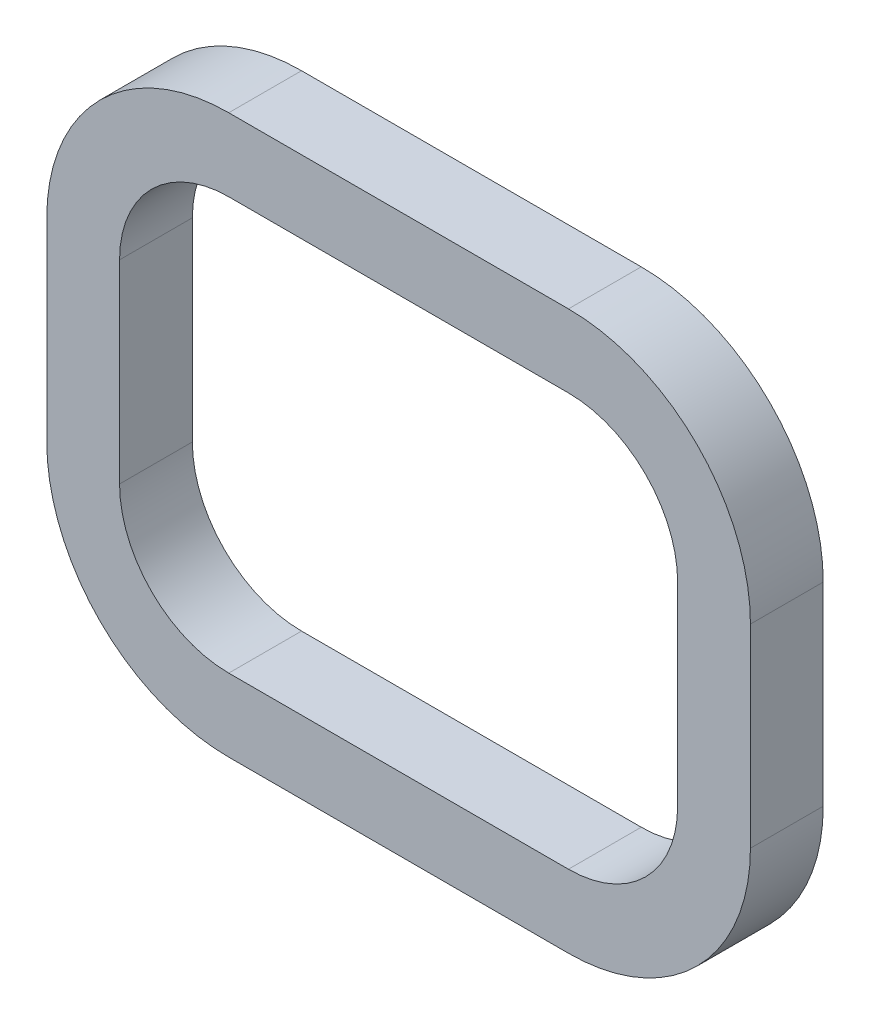
ISO-10303-21;
HEADER;
FILE_DESCRIPTION(('STEP AP214'),'2;1');
FILE_NAME('part.step','',(''),(''),'','','');
FILE_SCHEMA(('AUTOMOTIVE_DESIGN { 1 0 10303 214 1 1 1 1 }'));
ENDSEC;
DATA;
#1=APPLICATION_CONTEXT('core data for automotive mechanical design processes');
#2=APPLICATION_PROTOCOL_DEFINITION('international standard','automotive_design',2000,#1);
#3=PRODUCT_CONTEXT('',#1,'mechanical');
#4=PRODUCT('Part','Part','',(#3));
#5=PRODUCT_RELATED_PRODUCT_CATEGORY('part','',(#4));
#6=PRODUCT_DEFINITION_FORMATION('','',#4);
#7=PRODUCT_DEFINITION_CONTEXT('part definition',#1,'design');
#8=PRODUCT_DEFINITION('design','',#6,#7);
#9=PRODUCT_DEFINITION_SHAPE('','',#8);
#10=(LENGTH_UNIT() NAMED_UNIT(*) SI_UNIT(.MILLI.,.METRE.));
#11=(NAMED_UNIT(*) PLANE_ANGLE_UNIT() SI_UNIT($,.RADIAN.));
#12=(NAMED_UNIT(*) SI_UNIT($,.STERADIAN.) SOLID_ANGLE_UNIT());
#13=UNCERTAINTY_MEASURE_WITH_UNIT(LENGTH_MEASURE(1.E-05),#10,'distance_accuracy_value','');
#14=(GEOMETRIC_REPRESENTATION_CONTEXT(3) GLOBAL_UNCERTAINTY_ASSIGNED_CONTEXT((#13)) GLOBAL_UNIT_ASSIGNED_CONTEXT((#10,
#11,#12)) REPRESENTATION_CONTEXT('',''));
#15=CARTESIAN_POINT('',(0.,0.,0.));
#16=DIRECTION('',(0.,0.,1.));
#17=DIRECTION('',(1.,0.,0.));
#18=AXIS2_PLACEMENT_3D('',#15,#16,#17);
#19=CARTESIAN_POINT('',(35.,20.,7.5));
#20=DIRECTION('',(0.,0.,-1.));
#21=DIRECTION('',(-1.,0.,0.));
#22=AXIS2_PLACEMENT_3D('',#19,#20,#21);
#23=PLANE('',#22);
#24=CARTESIAN_POINT('',(35.,20.,7.5));
#25=DIRECTION('',(0.,0.,-1.));
#26=DIRECTION('',(-1.,0.,0.));
#27=AXIS2_PLACEMENT_3D('',#24,#25,#26);
#28=CIRCLE('',#27,37.5);
#29=CARTESIAN_POINT('',(72.5,20.,7.5));
#30=VERTEX_POINT('',#29);
#31=CARTESIAN_POINT('',(35.,57.5,7.5));
#32=VERTEX_POINT('',#31);
#33=EDGE_CURVE('E262',#30,#32,#28,.F.);
#34=ORIENTED_EDGE('',*,*,#33,.T.);
#35=DIRECTION('',(-1.,0.,0.));
#36=VECTOR('',#35,1.);
#37=CARTESIAN_POINT('',(35.,57.5,7.5));
#38=LINE('',#37,#36);
#39=CARTESIAN_POINT('',(-35.,57.5,7.5));
#40=VERTEX_POINT('',#39);
#41=EDGE_CURVE('E265',#32,#40,#38,.T.);
#42=ORIENTED_EDGE('',*,*,#41,.T.);
#43=CARTESIAN_POINT('',(-35.,20.,7.5));
#44=DIRECTION('',(0.,0.,-1.));
#45=DIRECTION('',(-1.,0.,0.));
#46=AXIS2_PLACEMENT_3D('',#43,#44,#45);
#47=CIRCLE('',#46,37.5);
#48=CARTESIAN_POINT('',(-72.5,20.,7.5));
#49=VERTEX_POINT('',#48);
#50=EDGE_CURVE('E268',#40,#49,#47,.F.);
#51=ORIENTED_EDGE('',*,*,#50,.T.);
#52=DIRECTION('',(0.,-1.,0.));
#53=VECTOR('',#52,1.);
#54=CARTESIAN_POINT('',(-72.5,20.,7.5));
#55=LINE('',#54,#53);
#56=CARTESIAN_POINT('',(-72.5,-20.,7.5));
#57=VERTEX_POINT('',#56);
#58=EDGE_CURVE('E270',#49,#57,#55,.T.);
#59=ORIENTED_EDGE('',*,*,#58,.T.);
#60=CARTESIAN_POINT('',(-35.,-20.,7.5));
#61=DIRECTION('',(0.,0.,-1.));
#62=DIRECTION('',(-1.,0.,0.));
#63=AXIS2_PLACEMENT_3D('',#60,#61,#62);
#64=CIRCLE('',#63,37.5);
#65=CARTESIAN_POINT('',(-35.,-57.5,7.5));
#66=VERTEX_POINT('',#65);
#67=EDGE_CURVE('E272',#57,#66,#64,.F.);
#68=ORIENTED_EDGE('',*,*,#67,.T.);
#69=DIRECTION('',(1.,0.,0.));
#70=VECTOR('',#69,1.);
#71=CARTESIAN_POINT('',(35.,-57.5,7.5));
#72=LINE('',#71,#70);
#73=CARTESIAN_POINT('',(35.,-57.5,7.5));
#74=VERTEX_POINT('',#73);
#75=EDGE_CURVE('E274',#66,#74,#72,.T.);
#76=ORIENTED_EDGE('',*,*,#75,.T.);
#77=CARTESIAN_POINT('',(35.,-20.,7.5));
#78=DIRECTION('',(0.,0.,-1.));
#79=DIRECTION('',(-1.,0.,0.));
#80=AXIS2_PLACEMENT_3D('',#77,#78,#79);
#81=CIRCLE('',#80,37.5);
#82=CARTESIAN_POINT('',(72.5,-20.,7.5));
#83=VERTEX_POINT('',#82);
#84=EDGE_CURVE('E276',#74,#83,#81,.F.);
#85=ORIENTED_EDGE('',*,*,#84,.T.);
#86=DIRECTION('',(0.,1.,0.));
#87=VECTOR('',#86,1.);
#88=CARTESIAN_POINT('',(72.5,20.,7.5));
#89=LINE('',#88,#87);
#90=EDGE_CURVE('E278',#83,#30,#89,.T.);
#91=ORIENTED_EDGE('',*,*,#90,.T.);
#92=EDGE_LOOP('',(#34,#42,#51,#59,#68,#76,#85,#91));
#93=FACE_BOUND('',#92,.T.);
#94=CARTESIAN_POINT('',(35.,20.,7.5));
#95=DIRECTION('',(0.,0.,-1.));
#96=DIRECTION('',(-1.,0.,0.));
#97=AXIS2_PLACEMENT_3D('',#94,#95,#96);
#98=CIRCLE('',#97,22.5);
#99=CARTESIAN_POINT('',(57.5,20.,7.5));
#100=VERTEX_POINT('',#99);
#101=CARTESIAN_POINT('',(35.,42.5,7.5));
#102=VERTEX_POINT('',#101);
#103=EDGE_CURVE('E197',#100,#102,#98,.F.);
#104=ORIENTED_EDGE('',*,*,#103,.F.);
#105=DIRECTION('',(0.,1.,0.));
#106=VECTOR('',#105,1.);
#107=CARTESIAN_POINT('',(57.5,20.,7.5));
#108=LINE('',#107,#106);
#109=CARTESIAN_POINT('',(57.5,-20.,7.5));
#110=VERTEX_POINT('',#109);
#111=EDGE_CURVE('E230',#110,#100,#108,.T.);
#112=ORIENTED_EDGE('',*,*,#111,.F.);
#113=CARTESIAN_POINT('',(35.,-20.,7.5));
#114=DIRECTION('',(0.,0.,-1.));
#115=DIRECTION('',(-1.,0.,0.));
#116=AXIS2_PLACEMENT_3D('',#113,#114,#115);
#117=CIRCLE('',#116,22.5);
#118=CARTESIAN_POINT('',(35.,-42.5,7.5));
#119=VERTEX_POINT('',#118);
#120=EDGE_CURVE('E228',#119,#110,#117,.F.);
#121=ORIENTED_EDGE('',*,*,#120,.F.);
#122=DIRECTION('',(1.,0.,0.));
#123=VECTOR('',#122,1.);
#124=CARTESIAN_POINT('',(35.,-42.5,7.5));
#125=LINE('',#124,#123);
#126=CARTESIAN_POINT('',(-35.,-42.5,7.5));
#127=VERTEX_POINT('',#126);
#128=EDGE_CURVE('E226',#127,#119,#125,.T.);
#129=ORIENTED_EDGE('',*,*,#128,.F.);
#130=CARTESIAN_POINT('',(-35.,-20.,7.5));
#131=DIRECTION('',(0.,0.,-1.));
#132=DIRECTION('',(-1.,0.,0.));
#133=AXIS2_PLACEMENT_3D('',#130,#131,#132);
#134=CIRCLE('',#133,22.5);
#135=CARTESIAN_POINT('',(-57.5,-20.,7.5));
#136=VERTEX_POINT('',#135);
#137=EDGE_CURVE('E224',#136,#127,#134,.F.);
#138=ORIENTED_EDGE('',*,*,#137,.F.);
#139=DIRECTION('',(0.,-1.,0.));
#140=VECTOR('',#139,1.);
#141=CARTESIAN_POINT('',(-57.5,20.,7.5));
#142=LINE('',#141,#140);
#143=CARTESIAN_POINT('',(-57.5,20.,7.5));
#144=VERTEX_POINT('',#143);
#145=EDGE_CURVE('E220',#144,#136,#142,.T.);
#146=ORIENTED_EDGE('',*,*,#145,.F.);
#147=CARTESIAN_POINT('',(-35.,20.,7.5));
#148=DIRECTION('',(0.,0.,-1.));
#149=DIRECTION('',(-1.,0.,0.));
#150=AXIS2_PLACEMENT_3D('',#147,#148,#149);
#151=CIRCLE('',#150,22.5);
#152=CARTESIAN_POINT('',(-35.,42.5,7.5));
#153=VERTEX_POINT('',#152);
#154=EDGE_CURVE('E218',#153,#144,#151,.F.);
#155=ORIENTED_EDGE('',*,*,#154,.F.);
#156=DIRECTION('',(-1.,0.,0.));
#157=VECTOR('',#156,1.);
#158=CARTESIAN_POINT('',(35.,42.5,7.5));
#159=LINE('',#158,#157);
#160=EDGE_CURVE('E205',#102,#153,#159,.T.);
#161=ORIENTED_EDGE('',*,*,#160,.F.);
#162=EDGE_LOOP('',(#104,#112,#121,#129,#138,#146,#155,#161));
#163=FACE_BOUND('',#162,.T.);
#164=ADVANCED_FACE('F84',(#93,#163),#23,.F.);
#165=CARTESIAN_POINT('',(35.,20.,-7.5));
#166=DIRECTION('',(0.,0.,-1.));
#167=DIRECTION('',(-1.,0.,0.));
#168=AXIS2_PLACEMENT_3D('',#165,#166,#167);
#169=PLANE('',#168);
#170=CARTESIAN_POINT('',(35.,20.,-7.5));
#171=DIRECTION('',(0.,0.,-1.));
#172=DIRECTION('',(-1.,0.,0.));
#173=AXIS2_PLACEMENT_3D('',#170,#171,#172);
#174=CIRCLE('',#173,37.5);
#175=CARTESIAN_POINT('',(72.5,20.,-7.5));
#176=VERTEX_POINT('',#175);
#177=CARTESIAN_POINT('',(35.,57.5,-7.5));
#178=VERTEX_POINT('',#177);
#179=EDGE_CURVE('E213',#176,#178,#174,.F.);
#180=ORIENTED_EDGE('',*,*,#179,.F.);
#181=DIRECTION('',(0.,1.,0.));
#182=VECTOR('',#181,1.);
#183=CARTESIAN_POINT('',(72.5,20.,-7.5));
#184=LINE('',#183,#182);
#185=CARTESIAN_POINT('',(72.5,-20.,-7.5));
#186=VERTEX_POINT('',#185);
#187=EDGE_CURVE('E266',#186,#176,#184,.T.);
#188=ORIENTED_EDGE('',*,*,#187,.F.);
#189=CARTESIAN_POINT('',(35.,-20.,-7.5));
#190=DIRECTION('',(0.,0.,-1.));
#191=DIRECTION('',(-1.,0.,0.));
#192=AXIS2_PLACEMENT_3D('',#189,#190,#191);
#193=CIRCLE('',#192,37.5);
#194=CARTESIAN_POINT('',(35.,-57.5,-7.5));
#195=VERTEX_POINT('',#194);
#196=EDGE_CURVE('E293',#195,#186,#193,.F.);
#197=ORIENTED_EDGE('',*,*,#196,.F.);
#198=DIRECTION('',(1.,0.,0.));
#199=VECTOR('',#198,1.);
#200=CARTESIAN_POINT('',(35.,-57.5,-7.5));
#201=LINE('',#200,#199);
#202=CARTESIAN_POINT('',(-35.,-57.5,-7.5));
#203=VERTEX_POINT('',#202);
#204=EDGE_CURVE('E291',#203,#195,#201,.T.);
#205=ORIENTED_EDGE('',*,*,#204,.F.);
#206=CARTESIAN_POINT('',(-35.,-20.,-7.5));
#207=DIRECTION('',(0.,0.,-1.));
#208=DIRECTION('',(-1.,0.,0.));
#209=AXIS2_PLACEMENT_3D('',#206,#207,#208);
#210=CIRCLE('',#209,37.5);
#211=CARTESIAN_POINT('',(-72.5,-20.,-7.5));
#212=VERTEX_POINT('',#211);
#213=EDGE_CURVE('E289',#212,#203,#210,.F.);
#214=ORIENTED_EDGE('',*,*,#213,.F.);
#215=DIRECTION('',(0.,-1.,0.));
#216=VECTOR('',#215,1.);
#217=CARTESIAN_POINT('',(-72.5,20.,-7.5));
#218=LINE('',#217,#216);
#219=CARTESIAN_POINT('',(-72.5,20.,-7.5));
#220=VERTEX_POINT('',#219);
#221=EDGE_CURVE('E287',#220,#212,#218,.T.);
#222=ORIENTED_EDGE('',*,*,#221,.F.);
#223=CARTESIAN_POINT('',(-35.,20.,-7.5));
#224=DIRECTION('',(0.,0.,-1.));
#225=DIRECTION('',(-1.,0.,0.));
#226=AXIS2_PLACEMENT_3D('',#223,#224,#225);
#227=CIRCLE('',#226,37.5);
#228=CARTESIAN_POINT('',(-35.,57.5,-7.5));
#229=VERTEX_POINT('',#228);
#230=EDGE_CURVE('E285',#229,#220,#227,.F.);
#231=ORIENTED_EDGE('',*,*,#230,.F.);
#232=DIRECTION('',(-1.,0.,0.));
#233=VECTOR('',#232,1.);
#234=CARTESIAN_POINT('',(35.,57.5,-7.5));
#235=LINE('',#234,#233);
#236=EDGE_CURVE('E283',#178,#229,#235,.T.);
#237=ORIENTED_EDGE('',*,*,#236,.F.);
#238=EDGE_LOOP('',(#180,#188,#197,#205,#214,#222,#231,#237));
#239=FACE_BOUND('',#238,.T.);
#240=DIRECTION('',(0.,1.,0.));
#241=VECTOR('',#240,1.);
#242=CARTESIAN_POINT('',(57.5,20.,-7.5));
#243=LINE('',#242,#241);
#244=CARTESIAN_POINT('',(57.5,-20.,-7.5));
#245=VERTEX_POINT('',#244);
#246=CARTESIAN_POINT('',(57.5,20.,-7.5));
#247=VERTEX_POINT('',#246);
#248=EDGE_CURVE('E206',#245,#247,#243,.T.);
#249=ORIENTED_EDGE('',*,*,#248,.T.);
#250=CARTESIAN_POINT('',(35.,20.,-7.5));
#251=DIRECTION('',(0.,0.,-1.));
#252=DIRECTION('',(-1.,0.,0.));
#253=AXIS2_PLACEMENT_3D('',#250,#251,#252);
#254=CIRCLE('',#253,22.5);
#255=CARTESIAN_POINT('',(35.,42.5,-7.5));
#256=VERTEX_POINT('',#255);
#257=EDGE_CURVE('E107',#247,#256,#254,.F.);
#258=ORIENTED_EDGE('',*,*,#257,.T.);
#259=DIRECTION('',(-1.,0.,0.));
#260=VECTOR('',#259,1.);
#261=CARTESIAN_POINT('',(35.,42.5,-7.5));
#262=LINE('',#261,#260);
#263=CARTESIAN_POINT('',(-35.,42.5,-7.5));
#264=VERTEX_POINT('',#263);
#265=EDGE_CURVE('E212',#256,#264,#262,.T.);
#266=ORIENTED_EDGE('',*,*,#265,.T.);
#267=CARTESIAN_POINT('',(-35.,20.,-7.5));
#268=DIRECTION('',(0.,0.,-1.));
#269=DIRECTION('',(-1.,0.,0.));
#270=AXIS2_PLACEMENT_3D('',#267,#268,#269);
#271=CIRCLE('',#270,22.5);
#272=CARTESIAN_POINT('',(-57.5,20.,-7.5));
#273=VERTEX_POINT('',#272);
#274=EDGE_CURVE('E234',#264,#273,#271,.F.);
#275=ORIENTED_EDGE('',*,*,#274,.T.);
#276=DIRECTION('',(0.,-1.,0.));
#277=VECTOR('',#276,1.);
#278=CARTESIAN_POINT('',(-57.5,20.,-7.5));
#279=LINE('',#278,#277);
#280=CARTESIAN_POINT('',(-57.5,-20.,-7.5));
#281=VERTEX_POINT('',#280);
#282=EDGE_CURVE('E237',#273,#281,#279,.T.);
#283=ORIENTED_EDGE('',*,*,#282,.T.);
#284=CARTESIAN_POINT('',(-35.,-20.,-7.5));
#285=DIRECTION('',(0.,0.,-1.));
#286=DIRECTION('',(-1.,0.,0.));
#287=AXIS2_PLACEMENT_3D('',#284,#285,#286);
#288=CIRCLE('',#287,22.5);
#289=CARTESIAN_POINT('',(-35.,-42.5,-7.5));
#290=VERTEX_POINT('',#289);
#291=EDGE_CURVE('E240',#281,#290,#288,.F.);
#292=ORIENTED_EDGE('',*,*,#291,.T.);
#293=DIRECTION('',(1.,0.,0.));
#294=VECTOR('',#293,1.);
#295=CARTESIAN_POINT('',(35.,-42.5,-7.5));
#296=LINE('',#295,#294);
#297=CARTESIAN_POINT('',(35.,-42.5,-7.5));
#298=VERTEX_POINT('',#297);
#299=EDGE_CURVE('E243',#290,#298,#296,.T.);
#300=ORIENTED_EDGE('',*,*,#299,.T.);
#301=CARTESIAN_POINT('',(35.,-20.,-7.5));
#302=DIRECTION('',(0.,0.,-1.));
#303=DIRECTION('',(-1.,0.,0.));
#304=AXIS2_PLACEMENT_3D('',#301,#302,#303);
#305=CIRCLE('',#304,22.5);
#306=EDGE_CURVE('E246',#298,#245,#305,.F.);
#307=ORIENTED_EDGE('',*,*,#306,.T.);
#308=EDGE_LOOP('',(#249,#258,#266,#275,#283,#292,#300,#307));
#309=FACE_BOUND('',#308,.T.);
#310=ADVANCED_FACE('F323',(#239,#309),#169,.T.);
#311=CARTESIAN_POINT('',(35.,20.,7.5));
#312=DIRECTION('',(0.,0.,-1.));
#313=DIRECTION('',(-1.,0.,0.));
#314=AXIS2_PLACEMENT_3D('',#311,#312,#313);
#315=CYLINDRICAL_SURFACE('',#314,37.5);
#316=ORIENTED_EDGE('',*,*,#179,.T.);
#317=DIRECTION('',(0.,0.,-1.));
#318=VECTOR('',#317,1.);
#319=CARTESIAN_POINT('',(35.,57.5,7.5));
#320=LINE('',#319,#318);
#321=EDGE_CURVE('E12',#32,#178,#320,.T.);
#322=ORIENTED_EDGE('',*,*,#321,.F.);
#323=ORIENTED_EDGE('',*,*,#33,.F.);
#324=DIRECTION('',(0.,0.,-1.));
#325=VECTOR('',#324,1.);
#326=CARTESIAN_POINT('',(72.5,20.,7.5));
#327=LINE('',#326,#325);
#328=EDGE_CURVE('E280',#30,#176,#327,.T.);
#329=ORIENTED_EDGE('',*,*,#328,.T.);
#330=EDGE_LOOP('',(#316,#322,#323,#329));
#331=FACE_BOUND('',#330,.T.);
#332=ADVANCED_FACE('F86',(#331),#315,.T.);
#333=CARTESIAN_POINT('',(35.,57.5,7.5));
#334=DIRECTION('',(0.,-1.,0.));
#335=DIRECTION('',(0.,0.,-1.));
#336=AXIS2_PLACEMENT_3D('',#333,#334,#335);
#337=PLANE('',#336);
#338=ORIENTED_EDGE('',*,*,#236,.T.);
#339=DIRECTION('',(0.,0.,-1.));
#340=VECTOR('',#339,1.);
#341=CARTESIAN_POINT('',(-35.,57.5,7.5));
#342=LINE('',#341,#340);
#343=EDGE_CURVE('E92',#40,#229,#342,.T.);
#344=ORIENTED_EDGE('',*,*,#343,.F.);
#345=ORIENTED_EDGE('',*,*,#41,.F.);
#346=ORIENTED_EDGE('',*,*,#321,.T.);
#347=EDGE_LOOP('',(#338,#344,#345,#346));
#348=FACE_BOUND('',#347,.T.);
#349=ADVANCED_FACE('F340',(#348),#337,.F.);
#350=CARTESIAN_POINT('',(-35.,20.,7.5));
#351=DIRECTION('',(0.,0.,-1.));
#352=DIRECTION('',(-1.,0.,0.));
#353=AXIS2_PLACEMENT_3D('',#350,#351,#352);
#354=CYLINDRICAL_SURFACE('',#353,37.5);
#355=ORIENTED_EDGE('',*,*,#230,.T.);
#356=DIRECTION('',(0.,0.,-1.));
#357=VECTOR('',#356,1.);
#358=CARTESIAN_POINT('',(-72.5,20.,7.5));
#359=LINE('',#358,#357);
#360=EDGE_CURVE('E310',#49,#220,#359,.T.);
#361=ORIENTED_EDGE('',*,*,#360,.F.);
#362=ORIENTED_EDGE('',*,*,#50,.F.);
#363=ORIENTED_EDGE('',*,*,#343,.T.);
#364=EDGE_LOOP('',(#355,#361,#362,#363));
#365=FACE_BOUND('',#364,.T.);
#366=ADVANCED_FACE('F317',(#365),#354,.T.);
#367=CARTESIAN_POINT('',(-72.5,20.,7.5));
#368=DIRECTION('',(1.,0.,0.));
#369=DIRECTION('',(0.,1.,0.));
#370=AXIS2_PLACEMENT_3D('',#367,#368,#369);
#371=PLANE('',#370);
#372=ORIENTED_EDGE('',*,*,#221,.T.);
#373=DIRECTION('',(0.,0.,-1.));
#374=VECTOR('',#373,1.);
#375=CARTESIAN_POINT('',(-72.5,-20.,7.5));
#376=LINE('',#375,#374);
#377=EDGE_CURVE('E307',#57,#212,#376,.T.);
#378=ORIENTED_EDGE('',*,*,#377,.F.);
#379=ORIENTED_EDGE('',*,*,#58,.F.);
#380=ORIENTED_EDGE('',*,*,#360,.T.);
#381=EDGE_LOOP('',(#372,#378,#379,#380));
#382=FACE_BOUND('',#381,.T.);
#383=ADVANCED_FACE('F329',(#382),#371,.F.);
#384=CARTESIAN_POINT('',(-35.,-20.,7.5));
#385=DIRECTION('',(0.,0.,-1.));
#386=DIRECTION('',(-1.,0.,0.));
#387=AXIS2_PLACEMENT_3D('',#384,#385,#386);
#388=CYLINDRICAL_SURFACE('',#387,37.5);
#389=ORIENTED_EDGE('',*,*,#213,.T.);
#390=DIRECTION('',(0.,0.,-1.));
#391=VECTOR('',#390,1.);
#392=CARTESIAN_POINT('',(-35.,-57.5,7.5));
#393=LINE('',#392,#391);
#394=EDGE_CURVE('E304',#66,#203,#393,.T.);
#395=ORIENTED_EDGE('',*,*,#394,.F.);
#396=ORIENTED_EDGE('',*,*,#67,.F.);
#397=ORIENTED_EDGE('',*,*,#377,.T.);
#398=EDGE_LOOP('',(#389,#395,#396,#397));
#399=FACE_BOUND('',#398,.T.);
#400=ADVANCED_FACE('F333',(#399),#388,.T.);
#401=CARTESIAN_POINT('',(35.,-57.5,7.5));
#402=DIRECTION('',(0.,1.,0.));
#403=DIRECTION('',(0.,0.,1.));
#404=AXIS2_PLACEMENT_3D('',#401,#402,#403);
#405=PLANE('',#404);
#406=ORIENTED_EDGE('',*,*,#204,.T.);
#407=DIRECTION('',(0.,0.,-1.));
#408=VECTOR('',#407,1.);
#409=CARTESIAN_POINT('',(35.,-57.5,7.5));
#410=LINE('',#409,#408);
#411=EDGE_CURVE('E301',#74,#195,#410,.T.);
#412=ORIENTED_EDGE('',*,*,#411,.F.);
#413=ORIENTED_EDGE('',*,*,#75,.F.);
#414=ORIENTED_EDGE('',*,*,#394,.T.);
#415=EDGE_LOOP('',(#406,#412,#413,#414));
#416=FACE_BOUND('',#415,.T.);
#417=ADVANCED_FACE('F353',(#416),#405,.F.);
#418=CARTESIAN_POINT('',(35.,-20.,7.5));
#419=DIRECTION('',(0.,0.,-1.));
#420=DIRECTION('',(-1.,0.,0.));
#421=AXIS2_PLACEMENT_3D('',#418,#419,#420);
#422=CYLINDRICAL_SURFACE('',#421,37.5);
#423=ORIENTED_EDGE('',*,*,#196,.T.);
#424=DIRECTION('',(0.,0.,-1.));
#425=VECTOR('',#424,1.);
#426=CARTESIAN_POINT('',(72.5,-20.,7.5));
#427=LINE('',#426,#425);
#428=EDGE_CURVE('E298',#83,#186,#427,.T.);
#429=ORIENTED_EDGE('',*,*,#428,.F.);
#430=ORIENTED_EDGE('',*,*,#84,.F.);
#431=ORIENTED_EDGE('',*,*,#411,.T.);
#432=EDGE_LOOP('',(#423,#429,#430,#431));
#433=FACE_BOUND('',#432,.T.);
#434=ADVANCED_FACE('F351',(#433),#422,.T.);
#435=CARTESIAN_POINT('',(72.5,20.,7.5));
#436=DIRECTION('',(-1.,0.,0.));
#437=DIRECTION('',(0.,-1.,0.));
#438=AXIS2_PLACEMENT_3D('',#435,#436,#437);
#439=PLANE('',#438);
#440=ORIENTED_EDGE('',*,*,#187,.T.);
#441=ORIENTED_EDGE('',*,*,#328,.F.);
#442=ORIENTED_EDGE('',*,*,#90,.F.);
#443=ORIENTED_EDGE('',*,*,#428,.T.);
#444=EDGE_LOOP('',(#440,#441,#442,#443));
#445=FACE_BOUND('',#444,.T.);
#446=ADVANCED_FACE('F346',(#445),#439,.F.);
#447=CARTESIAN_POINT('',(35.,20.,7.5));
#448=DIRECTION('',(0.,0.,-1.));
#449=DIRECTION('',(-1.,0.,0.));
#450=AXIS2_PLACEMENT_3D('',#447,#448,#449);
#451=CYLINDRICAL_SURFACE('',#450,22.5);
#452=ORIENTED_EDGE('',*,*,#257,.F.);
#453=DIRECTION('',(0.,0.,-1.));
#454=VECTOR('',#453,1.);
#455=CARTESIAN_POINT('',(57.5,20.,7.5));
#456=LINE('',#455,#454);
#457=EDGE_CURVE('E201',#100,#247,#456,.T.);
#458=ORIENTED_EDGE('',*,*,#457,.F.);
#459=ORIENTED_EDGE('',*,*,#103,.T.);
#460=DIRECTION('',(0.,0.,-1.));
#461=VECTOR('',#460,1.);
#462=CARTESIAN_POINT('',(35.,42.5,7.5));
#463=LINE('',#462,#461);
#464=EDGE_CURVE('E200',#102,#256,#463,.T.);
#465=ORIENTED_EDGE('',*,*,#464,.T.);
#466=EDGE_LOOP('',(#452,#458,#459,#465));
#467=FACE_BOUND('',#466,.T.);
#468=ADVANCED_FACE('F199',(#467),#451,.F.);
#469=CARTESIAN_POINT('',(35.,42.5,7.5));
#470=DIRECTION('',(0.,-1.,0.));
#471=DIRECTION('',(0.,0.,-1.));
#472=AXIS2_PLACEMENT_3D('',#469,#470,#471);
#473=PLANE('',#472);
#474=ORIENTED_EDGE('',*,*,#265,.F.);
#475=ORIENTED_EDGE('',*,*,#464,.F.);
#476=ORIENTED_EDGE('',*,*,#160,.T.);
#477=DIRECTION('',(0.,0.,-1.));
#478=VECTOR('',#477,1.);
#479=CARTESIAN_POINT('',(-35.,42.5,7.5));
#480=LINE('',#479,#478);
#481=EDGE_CURVE('E214',#153,#264,#480,.T.);
#482=ORIENTED_EDGE('',*,*,#481,.T.);
#483=EDGE_LOOP('',(#474,#475,#476,#482));
#484=FACE_BOUND('',#483,.T.);
#485=ADVANCED_FACE('F209',(#484),#473,.T.);
#486=CARTESIAN_POINT('',(-35.,20.,7.5));
#487=DIRECTION('',(0.,0.,-1.));
#488=DIRECTION('',(-1.,0.,0.));
#489=AXIS2_PLACEMENT_3D('',#486,#487,#488);
#490=CYLINDRICAL_SURFACE('',#489,22.5);
#491=ORIENTED_EDGE('',*,*,#274,.F.);
#492=ORIENTED_EDGE('',*,*,#481,.F.);
#493=ORIENTED_EDGE('',*,*,#154,.T.);
#494=DIRECTION('',(0.,0.,-1.));
#495=VECTOR('',#494,1.);
#496=CARTESIAN_POINT('',(-57.5,20.,7.5));
#497=LINE('',#496,#495);
#498=EDGE_CURVE('E259',#144,#273,#497,.T.);
#499=ORIENTED_EDGE('',*,*,#498,.T.);
#500=EDGE_LOOP('',(#491,#492,#493,#499));
#501=FACE_BOUND('',#500,.T.);
#502=ADVANCED_FACE('F378',(#501),#490,.F.);
#503=CARTESIAN_POINT('',(-57.5,20.,7.5));
#504=DIRECTION('',(1.,0.,0.));
#505=DIRECTION('',(0.,1.,0.));
#506=AXIS2_PLACEMENT_3D('',#503,#504,#505);
#507=PLANE('',#506);
#508=ORIENTED_EDGE('',*,*,#282,.F.);
#509=ORIENTED_EDGE('',*,*,#498,.F.);
#510=ORIENTED_EDGE('',*,*,#145,.T.);
#511=DIRECTION('',(0.,0.,-1.));
#512=VECTOR('',#511,1.);
#513=CARTESIAN_POINT('',(-57.5,-20.,7.5));
#514=LINE('',#513,#512);
#515=EDGE_CURVE('E257',#136,#281,#514,.T.);
#516=ORIENTED_EDGE('',*,*,#515,.T.);
#517=EDGE_LOOP('',(#508,#509,#510,#516));
#518=FACE_BOUND('',#517,.T.);
#519=ADVANCED_FACE('F382',(#518),#507,.T.);
#520=CARTESIAN_POINT('',(-35.,-20.,7.5));
#521=DIRECTION('',(0.,0.,-1.));
#522=DIRECTION('',(-1.,0.,0.));
#523=AXIS2_PLACEMENT_3D('',#520,#521,#522);
#524=CYLINDRICAL_SURFACE('',#523,22.5);
#525=ORIENTED_EDGE('',*,*,#291,.F.);
#526=ORIENTED_EDGE('',*,*,#515,.F.);
#527=ORIENTED_EDGE('',*,*,#137,.T.);
#528=DIRECTION('',(0.,0.,-1.));
#529=VECTOR('',#528,1.);
#530=CARTESIAN_POINT('',(-35.,-42.5,7.5));
#531=LINE('',#530,#529);
#532=EDGE_CURVE('E255',#127,#290,#531,.T.);
#533=ORIENTED_EDGE('',*,*,#532,.T.);
#534=EDGE_LOOP('',(#525,#526,#527,#533));
#535=FACE_BOUND('',#534,.T.);
#536=ADVANCED_FACE('F388',(#535),#524,.F.);
#537=CARTESIAN_POINT('',(35.,-42.5,7.5));
#538=DIRECTION('',(0.,1.,0.));
#539=DIRECTION('',(0.,0.,1.));
#540=AXIS2_PLACEMENT_3D('',#537,#538,#539);
#541=PLANE('',#540);
#542=ORIENTED_EDGE('',*,*,#299,.F.);
#543=ORIENTED_EDGE('',*,*,#532,.F.);
#544=ORIENTED_EDGE('',*,*,#128,.T.);
#545=DIRECTION('',(0.,0.,-1.));
#546=VECTOR('',#545,1.);
#547=CARTESIAN_POINT('',(35.,-42.5,7.5));
#548=LINE('',#547,#546);
#549=EDGE_CURVE('E253',#119,#298,#548,.T.);
#550=ORIENTED_EDGE('',*,*,#549,.T.);
#551=EDGE_LOOP('',(#542,#543,#544,#550));
#552=FACE_BOUND('',#551,.T.);
#553=ADVANCED_FACE('F392',(#552),#541,.T.);
#554=CARTESIAN_POINT('',(35.,-20.,7.5));
#555=DIRECTION('',(0.,0.,-1.));
#556=DIRECTION('',(-1.,0.,0.));
#557=AXIS2_PLACEMENT_3D('',#554,#555,#556);
#558=CYLINDRICAL_SURFACE('',#557,22.5);
#559=ORIENTED_EDGE('',*,*,#306,.F.);
#560=ORIENTED_EDGE('',*,*,#549,.F.);
#561=ORIENTED_EDGE('',*,*,#120,.T.);
#562=DIRECTION('',(0.,0.,-1.));
#563=VECTOR('',#562,1.);
#564=CARTESIAN_POINT('',(57.5,-20.,7.5));
#565=LINE('',#564,#563);
#566=EDGE_CURVE('E99',#110,#245,#565,.T.);
#567=ORIENTED_EDGE('',*,*,#566,.T.);
#568=EDGE_LOOP('',(#559,#560,#561,#567));
#569=FACE_BOUND('',#568,.T.);
#570=ADVANCED_FACE('F396',(#569),#558,.F.);
#571=CARTESIAN_POINT('',(57.5,20.,7.5));
#572=DIRECTION('',(-1.,0.,0.));
#573=DIRECTION('',(0.,-1.,0.));
#574=AXIS2_PLACEMENT_3D('',#571,#572,#573);
#575=PLANE('',#574);
#576=ORIENTED_EDGE('',*,*,#248,.F.);
#577=ORIENTED_EDGE('',*,*,#566,.F.);
#578=ORIENTED_EDGE('',*,*,#111,.T.);
#579=ORIENTED_EDGE('',*,*,#457,.T.);
#580=EDGE_LOOP('',(#576,#577,#578,#579));
#581=FACE_BOUND('',#580,.T.);
#582=ADVANCED_FACE('F400',(#581),#575,.T.);
#583=CLOSED_SHELL('',(#164,#310,#332,#349,#366,#383,#400,#417,#434,#446,#468,#485,#502,#519,
#536,#553,#570,#582));
#584=MANIFOLD_SOLID_BREP('B2',#583);
#585=ADVANCED_BREP_SHAPE_REPRESENTATION('',(#18,#584),#14);
#586=SHAPE_DEFINITION_REPRESENTATION(#9,#585);
ENDSEC;
END-ISO-10303-21;
